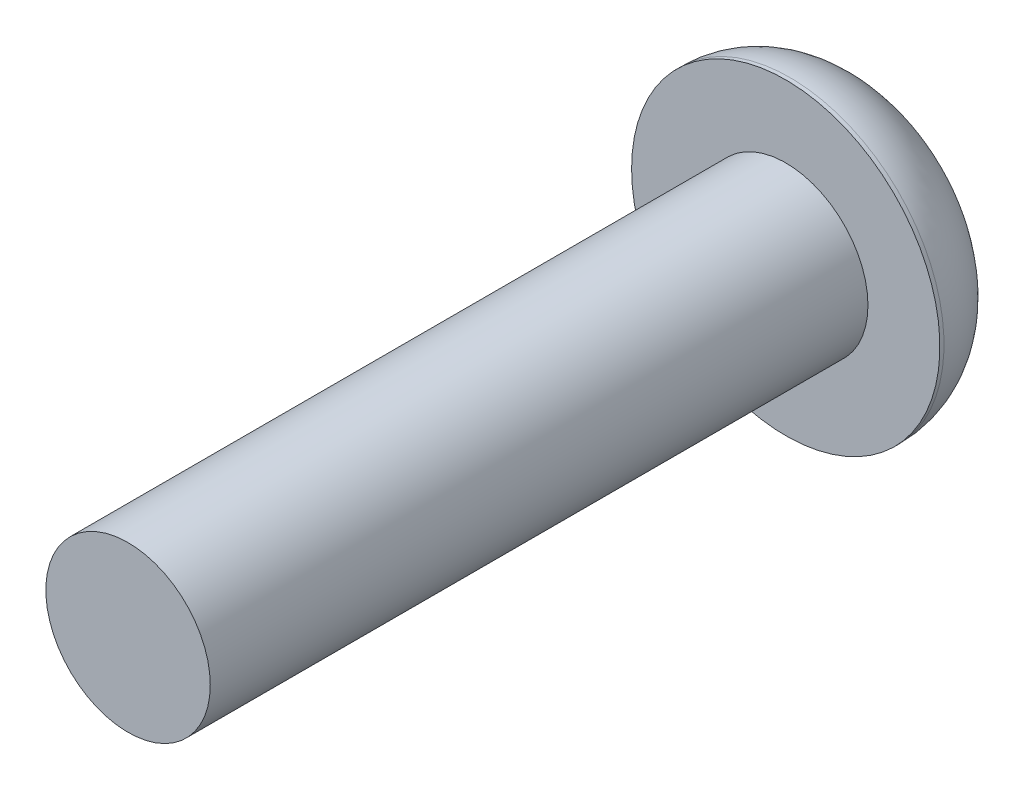
ISO-10303-21;
HEADER;
FILE_DESCRIPTION(('STEP AP214'),'2;1');
FILE_NAME('part.step','',(''),(''),'','','');
FILE_SCHEMA(('AUTOMOTIVE_DESIGN { 1 0 10303 214 1 1 1 1 }'));
ENDSEC;
DATA;
#1=APPLICATION_CONTEXT('core data for automotive mechanical design processes');
#2=APPLICATION_PROTOCOL_DEFINITION('international standard','automotive_design',2000,#1);
#3=PRODUCT_CONTEXT('',#1,'mechanical');
#4=PRODUCT('Part','Part','',(#3));
#5=PRODUCT_RELATED_PRODUCT_CATEGORY('part','',(#4));
#6=PRODUCT_DEFINITION_FORMATION('','',#4);
#7=PRODUCT_DEFINITION_CONTEXT('part definition',#1,'design');
#8=PRODUCT_DEFINITION('design','',#6,#7);
#9=PRODUCT_DEFINITION_SHAPE('','',#8);
#10=(LENGTH_UNIT() NAMED_UNIT(*) SI_UNIT(.MILLI.,.METRE.));
#11=(NAMED_UNIT(*) PLANE_ANGLE_UNIT() SI_UNIT($,.RADIAN.));
#12=(NAMED_UNIT(*) SI_UNIT($,.STERADIAN.) SOLID_ANGLE_UNIT());
#13=UNCERTAINTY_MEASURE_WITH_UNIT(LENGTH_MEASURE(1.E-05),#10,'distance_accuracy_value','');
#14=(GEOMETRIC_REPRESENTATION_CONTEXT(3) GLOBAL_UNCERTAINTY_ASSIGNED_CONTEXT((#13)) GLOBAL_UNIT_ASSIGNED_CONTEXT((#10,
#11,#12)) REPRESENTATION_CONTEXT('',''));
#15=CARTESIAN_POINT('',(0.,0.,0.));
#16=DIRECTION('',(0.,0.,1.));
#17=DIRECTION('',(1.,0.,0.));
#18=AXIS2_PLACEMENT_3D('',#15,#16,#17);
#19=CARTESIAN_POINT('',(0.,0.,16.));
#20=DIRECTION('',(0.,0.,-1.));
#21=DIRECTION('',(-1.,0.,0.));
#22=AXIS2_PLACEMENT_3D('',#19,#20,#21);
#23=CYLINDRICAL_SURFACE('',#22,2.);
#24=CARTESIAN_POINT('',(0.,0.,16.));
#25=DIRECTION('',(0.,0.,1.));
#26=DIRECTION('',(1.,0.,0.));
#27=AXIS2_PLACEMENT_3D('',#24,#25,#26);
#28=CIRCLE('',#27,2.);
#29=CARTESIAN_POINT('',(2.,0.,16.));
#30=VERTEX_POINT('',#29);
#31=EDGE_CURVE('E50',#30,#30,#28,.T.);
#32=ORIENTED_EDGE('',*,*,#31,.F.);
#33=EDGE_LOOP('',(#32));
#34=FACE_BOUND('',#33,.T.);
#35=CARTESIAN_POINT('',(0.,0.,0.));
#36=DIRECTION('',(0.,0.,1.));
#37=DIRECTION('',(1.,0.,0.));
#38=AXIS2_PLACEMENT_3D('',#35,#36,#37);
#39=CIRCLE('',#38,2.);
#40=CARTESIAN_POINT('',(2.,0.,0.));
#41=VERTEX_POINT('',#40);
#42=EDGE_CURVE('E55',#41,#41,#39,.T.);
#43=ORIENTED_EDGE('',*,*,#42,.T.);
#44=EDGE_LOOP('',(#43));
#45=FACE_BOUND('',#44,.T.);
#46=ADVANCED_FACE('F37',(#34,#45),#23,.T.);
#47=CARTESIAN_POINT('',(0.,0.,16.));
#48=DIRECTION('',(0.,0.,1.));
#49=DIRECTION('',(1.,0.,0.));
#50=AXIS2_PLACEMENT_3D('',#47,#48,#49);
#51=PLANE('',#50);
#52=ORIENTED_EDGE('',*,*,#31,.T.);
#53=EDGE_LOOP('',(#52));
#54=FACE_BOUND('',#53,.T.);
#55=ADVANCED_FACE('F82',(#54),#51,.T.);
#56=CARTESIAN_POINT('',(0.,0.,-2.1));
#57=DIRECTION('',(0.,0.,1.));
#58=DIRECTION('',(1.,0.,0.));
#59=AXIS2_PLACEMENT_3D('',#56,#57,#58);
#60=CYLINDRICAL_SURFACE('',#59,3.75);
#61=CARTESIAN_POINT('',(0.,0.,-0.1));
#62=DIRECTION('',(0.,0.,-1.));
#63=DIRECTION('',(-1.,0.,0.));
#64=AXIS2_PLACEMENT_3D('',#61,#62,#63);
#65=CIRCLE('',#64,3.75);
#66=CARTESIAN_POINT('',(-3.75,0.,-0.1));
#67=VERTEX_POINT('',#66);
#68=EDGE_CURVE('E10',#67,#67,#65,.F.);
#69=ORIENTED_EDGE('',*,*,#68,.T.);
#70=EDGE_LOOP('',(#69));
#71=FACE_BOUND('',#70,.T.);
#72=CARTESIAN_POINT('',(0.,0.,0.));
#73=DIRECTION('',(0.,0.,-1.));
#74=DIRECTION('',(-1.,0.,0.));
#75=AXIS2_PLACEMENT_3D('',#72,#73,#74);
#76=CIRCLE('',#75,3.75);
#77=CARTESIAN_POINT('',(-3.75,0.,0.));
#78=VERTEX_POINT('',#77);
#79=EDGE_CURVE('E60',#78,#78,#76,.T.);
#80=ORIENTED_EDGE('',*,*,#79,.T.);
#81=EDGE_LOOP('',(#80));
#82=FACE_BOUND('',#81,.T.);
#83=ADVANCED_FACE('F66',(#71,#82),#60,.T.);
#84=CARTESIAN_POINT('',(0.,0.,-2.1));
#85=DIRECTION('',(0.,0.,-1.));
#86=DIRECTION('',(-1.,0.,0.));
#87=AXIS2_PLACEMENT_3D('',#84,#85,#86);
#88=PLANE('',#87);
#89=CARTESIAN_POINT('',(0.,0.,-2.1));
#90=DIRECTION('',(0.,0.,-1.));
#91=DIRECTION('',(-1.,0.,0.));
#92=AXIS2_PLACEMENT_3D('',#89,#90,#91);
#93=CIRCLE('',#92,1.75);
#94=CARTESIAN_POINT('',(-1.75,0.,-2.1));
#95=VERTEX_POINT('',#94);
#96=EDGE_CURVE('E45',#95,#95,#93,.T.);
#97=ORIENTED_EDGE('',*,*,#96,.T.);
#98=EDGE_LOOP('',(#97));
#99=FACE_BOUND('',#98,.T.);
#100=ADVANCED_FACE('F70',(#99),#88,.T.);
#101=CARTESIAN_POINT('',(0.,0.,0.));
#102=DIRECTION('',(0.,0.,-1.));
#103=DIRECTION('',(-1.,0.,0.));
#104=AXIS2_PLACEMENT_3D('',#101,#102,#103);
#105=PLANE('',#104);
#106=ORIENTED_EDGE('',*,*,#42,.F.);
#107=EDGE_LOOP('',(#106));
#108=FACE_BOUND('',#107,.T.);
#109=ORIENTED_EDGE('',*,*,#79,.F.);
#110=EDGE_LOOP('',(#109));
#111=FACE_BOUND('',#110,.T.);
#112=ADVANCED_FACE('F68',(#108,#111),#105,.F.);
#113=CARTESIAN_POINT('',(0.,0.,-0.1));
#114=DIRECTION('',(0.,0.,-1.));
#115=DIRECTION('',(-1.,0.,0.));
#116=AXIS2_PLACEMENT_3D('',#113,#114,#115);
#117=DEGENERATE_TOROIDAL_SURFACE('',#116,1.75,2.,.T.);
#118=ORIENTED_EDGE('',*,*,#68,.F.);
#119=EDGE_LOOP('',(#118));
#120=FACE_BOUND('',#119,.T.);
#121=ORIENTED_EDGE('',*,*,#96,.F.);
#122=EDGE_LOOP('',(#121));
#123=FACE_BOUND('',#122,.T.);
#124=ADVANCED_FACE('F39',(#120,#123),#117,.T.);
#125=CLOSED_SHELL('',(#46,#55,#83,#100,#112,#124));
#126=MANIFOLD_SOLID_BREP('B2',#125);
#127=ADVANCED_BREP_SHAPE_REPRESENTATION('',(#18,#126),#14);
#128=SHAPE_DEFINITION_REPRESENTATION(#9,#127);
ENDSEC;
END-ISO-10303-21;
